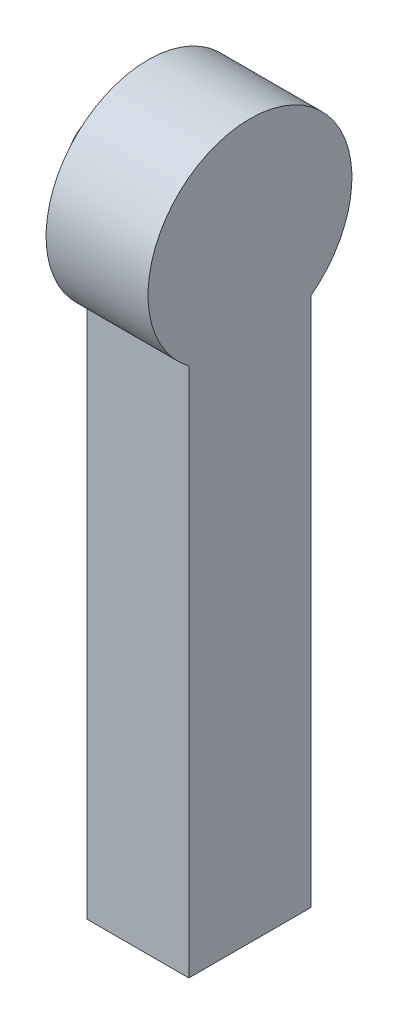
ISO-10303-21;
HEADER;
FILE_DESCRIPTION(('STEP AP214'),'2;1');
FILE_NAME('part.step','',(''),(''),'','','');
FILE_SCHEMA(('AUTOMOTIVE_DESIGN { 1 0 10303 214 1 1 1 1 }'));
ENDSEC;
DATA;
#1=APPLICATION_CONTEXT('core data for automotive mechanical design processes');
#2=APPLICATION_PROTOCOL_DEFINITION('international standard','automotive_design',2000,#1);
#3=PRODUCT_CONTEXT('',#1,'mechanical');
#4=PRODUCT('Part','Part','',(#3));
#5=PRODUCT_RELATED_PRODUCT_CATEGORY('part','',(#4));
#6=PRODUCT_DEFINITION_FORMATION('','',#4);
#7=PRODUCT_DEFINITION_CONTEXT('part definition',#1,'design');
#8=PRODUCT_DEFINITION('design','',#6,#7);
#9=PRODUCT_DEFINITION_SHAPE('','',#8);
#10=(LENGTH_UNIT() NAMED_UNIT(*) SI_UNIT(.MILLI.,.METRE.));
#11=(NAMED_UNIT(*) PLANE_ANGLE_UNIT() SI_UNIT($,.RADIAN.));
#12=(NAMED_UNIT(*) SI_UNIT($,.STERADIAN.) SOLID_ANGLE_UNIT());
#13=UNCERTAINTY_MEASURE_WITH_UNIT(LENGTH_MEASURE(1.E-05),#10,'distance_accuracy_value','');
#14=(GEOMETRIC_REPRESENTATION_CONTEXT(3) GLOBAL_UNCERTAINTY_ASSIGNED_CONTEXT((#13)) GLOBAL_UNIT_ASSIGNED_CONTEXT((#10,
#11,#12)) REPRESENTATION_CONTEXT('',''));
#15=CARTESIAN_POINT('',(0.,0.,0.));
#16=DIRECTION('',(0.,0.,1.));
#17=DIRECTION('',(1.,0.,0.));
#18=AXIS2_PLACEMENT_3D('',#15,#16,#17);
#19=CARTESIAN_POINT('',(2.5,0.,0.));
#20=DIRECTION('',(-1.,0.,0.));
#21=DIRECTION('',(0.,0.,1.));
#22=AXIS2_PLACEMENT_3D('',#19,#20,#21);
#23=CYLINDRICAL_SURFACE('',#22,1.5);
#24=CARTESIAN_POINT('',(2.5,0.,0.));
#25=DIRECTION('',(1.,0.,0.));
#26=DIRECTION('',(0.,0.,-1.));
#27=AXIS2_PLACEMENT_3D('',#24,#25,#26);
#28=CIRCLE('',#27,1.5);
#29=CARTESIAN_POINT('',(2.5,0.,-1.5));
#30=VERTEX_POINT('',#29);
#31=EDGE_CURVE('E11',#30,#30,#28,.T.);
#32=ORIENTED_EDGE('',*,*,#31,.F.);
#33=EDGE_LOOP('',(#32));
#34=FACE_BOUND('',#33,.T.);
#35=CARTESIAN_POINT('',(0.,0.,0.));
#36=DIRECTION('',(1.,0.,0.));
#37=DIRECTION('',(0.,0.,-1.));
#38=AXIS2_PLACEMENT_3D('',#35,#36,#37);
#39=CIRCLE('',#38,1.5);
#40=CARTESIAN_POINT('',(0.,0.,-1.5));
#41=VERTEX_POINT('',#40);
#42=EDGE_CURVE('E42',#41,#41,#39,.T.);
#43=ORIENTED_EDGE('',*,*,#42,.T.);
#44=EDGE_LOOP('',(#43));
#45=FACE_BOUND('',#44,.T.);
#46=ADVANCED_FACE('F39',(#34,#45),#23,.T.);
#47=CARTESIAN_POINT('',(0.,0.,0.));
#48=DIRECTION('',(1.,0.,0.));
#49=DIRECTION('',(0.,0.,-1.));
#50=AXIS2_PLACEMENT_3D('',#47,#48,#49);
#51=PLANE('',#50);
#52=ORIENTED_EDGE('',*,*,#42,.F.);
#53=EDGE_LOOP('',(#52));
#54=FACE_BOUND('',#53,.T.);
#55=ADVANCED_FACE('F141',(#54),#51,.F.);
#56=CARTESIAN_POINT('',(7.5,0.,0.));
#57=DIRECTION('',(-1.,0.,0.));
#58=DIRECTION('',(0.,0.,1.));
#59=AXIS2_PLACEMENT_3D('',#56,#57,#58);
#60=CYLINDRICAL_SURFACE('',#59,5.);
#61=CARTESIAN_POINT('',(7.5,0.,0.));
#62=DIRECTION('',(1.,0.,0.));
#63=DIRECTION('',(0.,0.,-1.));
#64=AXIS2_PLACEMENT_3D('',#61,#62,#63);
#65=CIRCLE('',#64,5.);
#66=CARTESIAN_POINT('',(7.5,-4.,-3.));
#67=VERTEX_POINT('',#66);
#68=CARTESIAN_POINT('',(7.5,-4.,3.));
#69=VERTEX_POINT('',#68);
#70=EDGE_CURVE('E123',#67,#69,#65,.T.);
#71=ORIENTED_EDGE('',*,*,#70,.F.);
#72=DIRECTION('',(-1.,0.,0.));
#73=VECTOR('',#72,1.);
#74=CARTESIAN_POINT('',(7.5,-4.,-3.));
#75=LINE('',#74,#73);
#76=CARTESIAN_POINT('',(2.5,-4.,-3.));
#77=VERTEX_POINT('',#76);
#78=EDGE_CURVE('E119',#67,#77,#75,.T.);
#79=ORIENTED_EDGE('',*,*,#78,.T.);
#80=CARTESIAN_POINT('',(2.5,0.,0.));
#81=DIRECTION('',(1.,0.,0.));
#82=DIRECTION('',(0.,0.,-1.));
#83=AXIS2_PLACEMENT_3D('',#80,#81,#82);
#84=CIRCLE('',#83,5.);
#85=CARTESIAN_POINT('',(2.5,-4.,3.));
#86=VERTEX_POINT('',#85);
#87=EDGE_CURVE('E122',#77,#86,#84,.T.);
#88=ORIENTED_EDGE('',*,*,#87,.T.);
#89=DIRECTION('',(-1.,0.,0.));
#90=VECTOR('',#89,1.);
#91=CARTESIAN_POINT('',(7.5,-4.,3.));
#92=LINE('',#91,#90);
#93=EDGE_CURVE('E82',#86,#69,#92,.F.);
#94=ORIENTED_EDGE('',*,*,#93,.T.);
#95=EDGE_LOOP('',(#71,#79,#88,#94));
#96=FACE_BOUND('',#95,.T.);
#97=ADVANCED_FACE('F130',(#96),#60,.T.);
#98=CARTESIAN_POINT('',(7.5,0.,0.));
#99=DIRECTION('',(1.,0.,0.));
#100=DIRECTION('',(0.,0.,-1.));
#101=AXIS2_PLACEMENT_3D('',#98,#99,#100);
#102=PLANE('',#101);
#103=ORIENTED_EDGE('',*,*,#70,.T.);
#104=DIRECTION('',(0.,1.,0.));
#105=VECTOR('',#104,1.);
#106=CARTESIAN_POINT('',(7.5,-30.,3.));
#107=LINE('',#106,#105);
#108=CARTESIAN_POINT('',(7.5,-30.,3.));
#109=VERTEX_POINT('',#108);
#110=EDGE_CURVE('E54',#109,#69,#107,.T.);
#111=ORIENTED_EDGE('',*,*,#110,.F.);
#112=DIRECTION('',(0.,0.,-1.));
#113=VECTOR('',#112,1.);
#114=CARTESIAN_POINT('',(7.5,-30.,-3.));
#115=LINE('',#114,#113);
#116=CARTESIAN_POINT('',(7.5,-30.,-3.));
#117=VERTEX_POINT('',#116);
#118=EDGE_CURVE('E97',#109,#117,#115,.T.);
#119=ORIENTED_EDGE('',*,*,#118,.T.);
#120=DIRECTION('',(0.,1.,0.));
#121=VECTOR('',#120,1.);
#122=CARTESIAN_POINT('',(7.5,-30.,-3.));
#123=LINE('',#122,#121);
#124=EDGE_CURVE('E111',#117,#67,#123,.T.);
#125=ORIENTED_EDGE('',*,*,#124,.T.);
#126=EDGE_LOOP('',(#103,#111,#119,#125));
#127=FACE_BOUND('',#126,.T.);
#128=ADVANCED_FACE('F133',(#127),#102,.T.);
#129=CARTESIAN_POINT('',(2.5,0.,0.));
#130=DIRECTION('',(1.,0.,0.));
#131=DIRECTION('',(0.,0.,-1.));
#132=AXIS2_PLACEMENT_3D('',#129,#130,#131);
#133=PLANE('',#132);
#134=ORIENTED_EDGE('',*,*,#87,.F.);
#135=DIRECTION('',(0.,1.,0.));
#136=VECTOR('',#135,1.);
#137=CARTESIAN_POINT('',(2.5,-30.,-3.));
#138=LINE('',#137,#136);
#139=CARTESIAN_POINT('',(2.5,-30.,-3.));
#140=VERTEX_POINT('',#139);
#141=EDGE_CURVE('E62',#140,#77,#138,.T.);
#142=ORIENTED_EDGE('',*,*,#141,.F.);
#143=DIRECTION('',(0.,0.,1.));
#144=VECTOR('',#143,1.);
#145=CARTESIAN_POINT('',(2.5,-30.,-3.));
#146=LINE('',#145,#144);
#147=CARTESIAN_POINT('',(2.5,-30.,3.));
#148=VERTEX_POINT('',#147);
#149=EDGE_CURVE('E95',#140,#148,#146,.T.);
#150=ORIENTED_EDGE('',*,*,#149,.T.);
#151=DIRECTION('',(0.,1.,0.));
#152=VECTOR('',#151,1.);
#153=CARTESIAN_POINT('',(2.5,-30.,3.));
#154=LINE('',#153,#152);
#155=EDGE_CURVE('E78',#148,#86,#154,.T.);
#156=ORIENTED_EDGE('',*,*,#155,.T.);
#157=EDGE_LOOP('',(#134,#142,#150,#156));
#158=FACE_BOUND('',#157,.T.);
#159=ORIENTED_EDGE('',*,*,#31,.T.);
#160=EDGE_LOOP('',(#159));
#161=FACE_BOUND('',#160,.T.);
#162=ADVANCED_FACE('F100',(#158,#161),#133,.F.);
#163=CARTESIAN_POINT('',(2.5,-30.,-3.));
#164=DIRECTION('',(0.,0.,-1.));
#165=DIRECTION('',(-1.,0.,0.));
#166=AXIS2_PLACEMENT_3D('',#163,#164,#165);
#167=PLANE('',#166);
#168=ORIENTED_EDGE('',*,*,#78,.F.);
#169=ORIENTED_EDGE('',*,*,#124,.F.);
#170=DIRECTION('',(-1.,0.,0.));
#171=VECTOR('',#170,1.);
#172=CARTESIAN_POINT('',(2.5,-30.,-3.));
#173=LINE('',#172,#171);
#174=EDGE_CURVE('E88',#117,#140,#173,.T.);
#175=ORIENTED_EDGE('',*,*,#174,.T.);
#176=ORIENTED_EDGE('',*,*,#141,.T.);
#177=EDGE_LOOP('',(#168,#169,#175,#176));
#178=FACE_BOUND('',#177,.T.);
#179=ADVANCED_FACE('F131',(#178),#167,.T.);
#180=CARTESIAN_POINT('',(2.5,-30.,3.));
#181=DIRECTION('',(0.,0.,1.));
#182=DIRECTION('',(1.,0.,0.));
#183=AXIS2_PLACEMENT_3D('',#180,#181,#182);
#184=PLANE('',#183);
#185=ORIENTED_EDGE('',*,*,#93,.F.);
#186=ORIENTED_EDGE('',*,*,#155,.F.);
#187=DIRECTION('',(1.,0.,0.));
#188=VECTOR('',#187,1.);
#189=CARTESIAN_POINT('',(2.5,-30.,3.));
#190=LINE('',#189,#188);
#191=EDGE_CURVE('E81',#148,#109,#190,.T.);
#192=ORIENTED_EDGE('',*,*,#191,.T.);
#193=ORIENTED_EDGE('',*,*,#110,.T.);
#194=EDGE_LOOP('',(#185,#186,#192,#193));
#195=FACE_BOUND('',#194,.T.);
#196=ADVANCED_FACE('F80',(#195),#184,.T.);
#197=CARTESIAN_POINT('',(0.,-30.,0.));
#198=DIRECTION('',(0.,1.,0.));
#199=DIRECTION('',(0.,0.,1.));
#200=AXIS2_PLACEMENT_3D('',#197,#198,#199);
#201=PLANE('',#200);
#202=ORIENTED_EDGE('',*,*,#149,.F.);
#203=ORIENTED_EDGE('',*,*,#174,.F.);
#204=ORIENTED_EDGE('',*,*,#118,.F.);
#205=ORIENTED_EDGE('',*,*,#191,.F.);
#206=EDGE_LOOP('',(#202,#203,#204,#205));
#207=FACE_BOUND('',#206,.T.);
#208=ADVANCED_FACE('F93',(#207),#201,.F.);
#209=CLOSED_SHELL('',(#46,#55,#97,#128,#162,#179,#196,#208));
#210=MANIFOLD_SOLID_BREP('B2',#209);
#211=ADVANCED_BREP_SHAPE_REPRESENTATION('',(#18,#210),#14);
#212=SHAPE_DEFINITION_REPRESENTATION(#9,#211);
ENDSEC;
END-ISO-10303-21;
